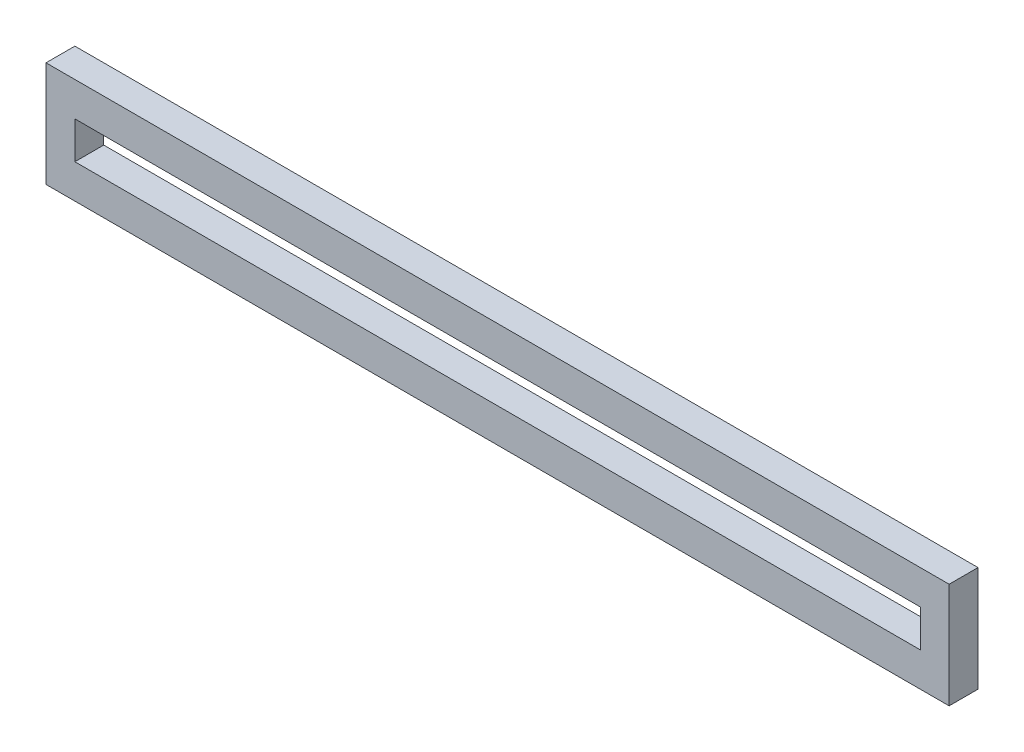
ISO-10303-21;
HEADER;
FILE_DESCRIPTION(('STEP AP214'),'2;1');
FILE_NAME('part.step','',(''),(''),'','','');
FILE_SCHEMA(('AUTOMOTIVE_DESIGN { 1 0 10303 214 1 1 1 1 }'));
ENDSEC;
DATA;
#1=APPLICATION_CONTEXT('core data for automotive mechanical design processes');
#2=APPLICATION_PROTOCOL_DEFINITION('international standard','automotive_design',2000,#1);
#3=PRODUCT_CONTEXT('',#1,'mechanical');
#4=PRODUCT('Part','Part','',(#3));
#5=PRODUCT_RELATED_PRODUCT_CATEGORY('part','',(#4));
#6=PRODUCT_DEFINITION_FORMATION('','',#4);
#7=PRODUCT_DEFINITION_CONTEXT('part definition',#1,'design');
#8=PRODUCT_DEFINITION('design','',#6,#7);
#9=PRODUCT_DEFINITION_SHAPE('','',#8);
#10=(LENGTH_UNIT() NAMED_UNIT(*) SI_UNIT(.MILLI.,.METRE.));
#11=(NAMED_UNIT(*) PLANE_ANGLE_UNIT() SI_UNIT($,.RADIAN.));
#12=(NAMED_UNIT(*) SI_UNIT($,.STERADIAN.) SOLID_ANGLE_UNIT());
#13=UNCERTAINTY_MEASURE_WITH_UNIT(LENGTH_MEASURE(1.E-05),#10,'distance_accuracy_value','');
#14=(GEOMETRIC_REPRESENTATION_CONTEXT(3) GLOBAL_UNCERTAINTY_ASSIGNED_CONTEXT((#13)) GLOBAL_UNIT_ASSIGNED_CONTEXT((#10,
#11,#12)) REPRESENTATION_CONTEXT('',''));
#15=CARTESIAN_POINT('',(0.,0.,0.));
#16=DIRECTION('',(0.,0.,1.));
#17=DIRECTION('',(1.,0.,0.));
#18=AXIS2_PLACEMENT_3D('',#15,#16,#17);
#19=CARTESIAN_POINT('',(0.,0.,2.54));
#20=DIRECTION('',(0.,0.,1.));
#21=DIRECTION('',(1.,0.,0.));
#22=AXIS2_PLACEMENT_3D('',#19,#20,#21);
#23=PLANE('',#22);
#24=DIRECTION('',(0.,1.,0.));
#25=VECTOR('',#24,1.);
#26=CARTESIAN_POINT('',(39.7305521607742,0.,2.54));
#27=LINE('',#26,#25);
#28=CARTESIAN_POINT('',(39.7305521607742,-9.27,2.54));
#29=VERTEX_POINT('',#28);
#30=CARTESIAN_POINT('',(39.7305521607742,0.,2.54));
#31=VERTEX_POINT('',#30);
#32=EDGE_CURVE('E155',#29,#31,#27,.T.);
#33=ORIENTED_EDGE('',*,*,#32,.T.);
#34=DIRECTION('',(-1.,0.,0.));
#35=VECTOR('',#34,1.);
#36=CARTESIAN_POINT('',(39.7305521607742,0.,2.54));
#37=LINE('',#36,#35);
#38=CARTESIAN_POINT('',(-39.7305521607742,0.,2.54));
#39=VERTEX_POINT('',#38);
#40=EDGE_CURVE('E159',#31,#39,#37,.T.);
#41=ORIENTED_EDGE('',*,*,#40,.T.);
#42=DIRECTION('',(0.,-1.,0.));
#43=VECTOR('',#42,1.);
#44=CARTESIAN_POINT('',(-39.7305521607742,0.,2.54));
#45=LINE('',#44,#43);
#46=CARTESIAN_POINT('',(-39.7305521607742,-9.27,2.54));
#47=VERTEX_POINT('',#46);
#48=EDGE_CURVE('E163',#39,#47,#45,.T.);
#49=ORIENTED_EDGE('',*,*,#48,.T.);
#50=DIRECTION('',(1.,0.,0.));
#51=VECTOR('',#50,1.);
#52=CARTESIAN_POINT('',(-39.7305521607742,-9.27,2.54));
#53=LINE('',#52,#51);
#54=EDGE_CURVE('E166',#47,#29,#53,.T.);
#55=ORIENTED_EDGE('',*,*,#54,.T.);
#56=EDGE_LOOP('',(#33,#41,#49,#55));
#57=FACE_BOUND('',#56,.T.);
#58=DIRECTION('',(1.,0.,0.));
#59=VECTOR('',#58,1.);
#60=CARTESIAN_POINT('',(-37.1905521607742,-6.26999999999998,2.54));
#61=LINE('',#60,#59);
#62=CARTESIAN_POINT('',(-37.1905521607742,-6.26999999999998,2.54));
#63=VERTEX_POINT('',#62);
#64=CARTESIAN_POINT('',(37.1905521607742,-6.26999999999998,2.54));
#65=VERTEX_POINT('',#64);
#66=EDGE_CURVE('E116',#63,#65,#61,.T.);
#67=ORIENTED_EDGE('',*,*,#66,.F.);
#68=DIRECTION('',(0.,-1.,0.));
#69=VECTOR('',#68,1.);
#70=CARTESIAN_POINT('',(-37.1905521607742,-2.99999999999997,2.54));
#71=LINE('',#70,#69);
#72=CARTESIAN_POINT('',(-37.1905521607742,-2.99999999999997,2.54));
#73=VERTEX_POINT('',#72);
#74=EDGE_CURVE('E107',#73,#63,#71,.T.);
#75=ORIENTED_EDGE('',*,*,#74,.F.);
#76=DIRECTION('',(-1.,0.,0.));
#77=VECTOR('',#76,1.);
#78=CARTESIAN_POINT('',(37.1905521607742,-2.99999999999996,2.54));
#79=LINE('',#78,#77);
#80=CARTESIAN_POINT('',(37.1905521607742,-2.99999999999996,2.54));
#81=VERTEX_POINT('',#80);
#82=EDGE_CURVE('E133',#81,#73,#79,.T.);
#83=ORIENTED_EDGE('',*,*,#82,.F.);
#84=DIRECTION('',(0.,1.,0.));
#85=VECTOR('',#84,1.);
#86=CARTESIAN_POINT('',(37.1905521607742,-2.99999999999996,2.54));
#87=LINE('',#86,#85);
#88=EDGE_CURVE('E129',#65,#81,#87,.T.);
#89=ORIENTED_EDGE('',*,*,#88,.F.);
#90=EDGE_LOOP('',(#67,#75,#83,#89));
#91=FACE_BOUND('',#90,.T.);
#92=ADVANCED_FACE('F41',(#57,#91),#23,.T.);
#93=CARTESIAN_POINT('',(0.,0.,0.));
#94=DIRECTION('',(0.,0.,1.));
#95=DIRECTION('',(1.,0.,0.));
#96=AXIS2_PLACEMENT_3D('',#93,#94,#95);
#97=PLANE('',#96);
#98=DIRECTION('',(-1.,0.,0.));
#99=VECTOR('',#98,1.);
#100=CARTESIAN_POINT('',(39.7305521607742,0.,0.));
#101=LINE('',#100,#99);
#102=CARTESIAN_POINT('',(39.7305521607742,0.,0.));
#103=VERTEX_POINT('',#102);
#104=CARTESIAN_POINT('',(-39.7305521607742,0.,0.));
#105=VERTEX_POINT('',#104);
#106=EDGE_CURVE('E125',#103,#105,#101,.T.);
#107=ORIENTED_EDGE('',*,*,#106,.F.);
#108=DIRECTION('',(0.,1.,0.));
#109=VECTOR('',#108,1.);
#110=CARTESIAN_POINT('',(39.7305521607742,-9.27,0.));
#111=LINE('',#110,#109);
#112=CARTESIAN_POINT('',(39.7305521607742,-9.27,0.));
#113=VERTEX_POINT('',#112);
#114=EDGE_CURVE('E160',#113,#103,#111,.T.);
#115=ORIENTED_EDGE('',*,*,#114,.F.);
#116=DIRECTION('',(1.,0.,0.));
#117=VECTOR('',#116,1.);
#118=CARTESIAN_POINT('',(-39.7305521607742,-9.27,0.));
#119=LINE('',#118,#117);
#120=CARTESIAN_POINT('',(-39.7305521607742,-9.27,0.));
#121=VERTEX_POINT('',#120);
#122=EDGE_CURVE('E177',#121,#113,#119,.T.);
#123=ORIENTED_EDGE('',*,*,#122,.F.);
#124=DIRECTION('',(0.,-1.,0.));
#125=VECTOR('',#124,1.);
#126=CARTESIAN_POINT('',(-39.7305521607742,-9.27,0.));
#127=LINE('',#126,#125);
#128=EDGE_CURVE('E174',#105,#121,#127,.T.);
#129=ORIENTED_EDGE('',*,*,#128,.F.);
#130=EDGE_LOOP('',(#107,#115,#123,#129));
#131=FACE_BOUND('',#130,.T.);
#132=DIRECTION('',(0.,-1.,0.));
#133=VECTOR('',#132,1.);
#134=CARTESIAN_POINT('',(-37.1905521607742,-2.99999999999997,0.));
#135=LINE('',#134,#133);
#136=CARTESIAN_POINT('',(-37.1905521607742,-2.99999999999997,0.));
#137=VERTEX_POINT('',#136);
#138=CARTESIAN_POINT('',(-37.1905521607742,-6.26999999999998,0.));
#139=VERTEX_POINT('',#138);
#140=EDGE_CURVE('E65',#137,#139,#135,.T.);
#141=ORIENTED_EDGE('',*,*,#140,.T.);
#142=DIRECTION('',(1.,0.,0.));
#143=VECTOR('',#142,1.);
#144=CARTESIAN_POINT('',(-37.1905521607742,-6.26999999999998,0.));
#145=LINE('',#144,#143);
#146=CARTESIAN_POINT('',(37.1905521607742,-6.26999999999998,0.));
#147=VERTEX_POINT('',#146);
#148=EDGE_CURVE('E123',#139,#147,#145,.T.);
#149=ORIENTED_EDGE('',*,*,#148,.T.);
#150=DIRECTION('',(0.,1.,0.));
#151=VECTOR('',#150,1.);
#152=CARTESIAN_POINT('',(37.1905521607742,-2.99999999999996,0.));
#153=LINE('',#152,#151);
#154=CARTESIAN_POINT('',(37.1905521607742,-2.99999999999996,0.));
#155=VERTEX_POINT('',#154);
#156=EDGE_CURVE('E142',#147,#155,#153,.T.);
#157=ORIENTED_EDGE('',*,*,#156,.T.);
#158=DIRECTION('',(-1.,0.,0.));
#159=VECTOR('',#158,1.);
#160=CARTESIAN_POINT('',(37.1905521607742,-2.99999999999996,0.));
#161=LINE('',#160,#159);
#162=EDGE_CURVE('E117',#155,#137,#161,.T.);
#163=ORIENTED_EDGE('',*,*,#162,.T.);
#164=EDGE_LOOP('',(#141,#149,#157,#163));
#165=FACE_BOUND('',#164,.T.);
#166=ADVANCED_FACE('F200',(#131,#165),#97,.F.);
#167=CARTESIAN_POINT('',(39.7305521607742,0.,2.54));
#168=DIRECTION('',(0.,-1.,0.));
#169=DIRECTION('',(1.,0.,0.));
#170=AXIS2_PLACEMENT_3D('',#167,#168,#169);
#171=PLANE('',#170);
#172=ORIENTED_EDGE('',*,*,#106,.T.);
#173=DIRECTION('',(0.,0.,-1.));
#174=VECTOR('',#173,1.);
#175=CARTESIAN_POINT('',(-39.7305521607742,0.,2.54));
#176=LINE('',#175,#174);
#177=EDGE_CURVE('E50',#39,#105,#176,.T.);
#178=ORIENTED_EDGE('',*,*,#177,.F.);
#179=ORIENTED_EDGE('',*,*,#40,.F.);
#180=DIRECTION('',(0.,0.,-1.));
#181=VECTOR('',#180,1.);
#182=CARTESIAN_POINT('',(39.7305521607742,0.,2.54));
#183=LINE('',#182,#181);
#184=EDGE_CURVE('E11',#31,#103,#183,.T.);
#185=ORIENTED_EDGE('',*,*,#184,.T.);
#186=EDGE_LOOP('',(#172,#178,#179,#185));
#187=FACE_BOUND('',#186,.T.);
#188=ADVANCED_FACE('F43',(#187),#171,.F.);
#189=CARTESIAN_POINT('',(-39.7305521607742,-9.27,2.54));
#190=DIRECTION('',(1.,0.,0.));
#191=DIRECTION('',(0.,0.,-1.));
#192=AXIS2_PLACEMENT_3D('',#189,#190,#191);
#193=PLANE('',#192);
#194=ORIENTED_EDGE('',*,*,#128,.T.);
#195=DIRECTION('',(0.,0.,-1.));
#196=VECTOR('',#195,1.);
#197=CARTESIAN_POINT('',(-39.7305521607742,-9.27,2.54));
#198=LINE('',#197,#196);
#199=EDGE_CURVE('E185',#47,#121,#198,.T.);
#200=ORIENTED_EDGE('',*,*,#199,.F.);
#201=ORIENTED_EDGE('',*,*,#48,.F.);
#202=ORIENTED_EDGE('',*,*,#177,.T.);
#203=EDGE_LOOP('',(#194,#200,#201,#202));
#204=FACE_BOUND('',#203,.T.);
#205=ADVANCED_FACE('F193',(#204),#193,.F.);
#206=CARTESIAN_POINT('',(-39.7305521607742,-9.27,2.54));
#207=DIRECTION('',(0.,1.,0.));
#208=DIRECTION('',(-1.,0.,0.));
#209=AXIS2_PLACEMENT_3D('',#206,#207,#208);
#210=PLANE('',#209);
#211=ORIENTED_EDGE('',*,*,#122,.T.);
#212=DIRECTION('',(0.,0.,-1.));
#213=VECTOR('',#212,1.);
#214=CARTESIAN_POINT('',(39.7305521607742,-9.27,2.54));
#215=LINE('',#214,#213);
#216=EDGE_CURVE('E170',#29,#113,#215,.T.);
#217=ORIENTED_EDGE('',*,*,#216,.F.);
#218=ORIENTED_EDGE('',*,*,#54,.F.);
#219=ORIENTED_EDGE('',*,*,#199,.T.);
#220=EDGE_LOOP('',(#211,#217,#218,#219));
#221=FACE_BOUND('',#220,.T.);
#222=ADVANCED_FACE('F205',(#221),#210,.F.);
#223=CARTESIAN_POINT('',(39.7305521607742,-9.27,2.54));
#224=DIRECTION('',(-1.,0.,0.));
#225=DIRECTION('',(0.,-1.,0.));
#226=AXIS2_PLACEMENT_3D('',#223,#224,#225);
#227=PLANE('',#226);
#228=ORIENTED_EDGE('',*,*,#114,.T.);
#229=ORIENTED_EDGE('',*,*,#184,.F.);
#230=ORIENTED_EDGE('',*,*,#32,.F.);
#231=ORIENTED_EDGE('',*,*,#216,.T.);
#232=EDGE_LOOP('',(#228,#229,#230,#231));
#233=FACE_BOUND('',#232,.T.);
#234=ADVANCED_FACE('F208',(#233),#227,.F.);
#235=CARTESIAN_POINT('',(-37.1905521607742,-2.99999999999997,2.54));
#236=DIRECTION('',(1.,0.,0.));
#237=DIRECTION('',(0.,0.,-1.));
#238=AXIS2_PLACEMENT_3D('',#235,#236,#237);
#239=PLANE('',#238);
#240=ORIENTED_EDGE('',*,*,#140,.F.);
#241=DIRECTION('',(0.,0.,-1.));
#242=VECTOR('',#241,1.);
#243=CARTESIAN_POINT('',(-37.1905521607742,-2.99999999999997,2.54));
#244=LINE('',#243,#242);
#245=EDGE_CURVE('E111',#73,#137,#244,.T.);
#246=ORIENTED_EDGE('',*,*,#245,.F.);
#247=ORIENTED_EDGE('',*,*,#74,.T.);
#248=DIRECTION('',(0.,0.,-1.));
#249=VECTOR('',#248,1.);
#250=CARTESIAN_POINT('',(-37.1905521607742,-6.26999999999998,2.54));
#251=LINE('',#250,#249);
#252=EDGE_CURVE('E110',#63,#139,#251,.T.);
#253=ORIENTED_EDGE('',*,*,#252,.T.);
#254=EDGE_LOOP('',(#240,#246,#247,#253));
#255=FACE_BOUND('',#254,.T.);
#256=ADVANCED_FACE('F109',(#255),#239,.T.);
#257=CARTESIAN_POINT('',(-37.1905521607742,-6.26999999999998,2.54));
#258=DIRECTION('',(0.,1.,0.));
#259=DIRECTION('',(0.,0.,1.));
#260=AXIS2_PLACEMENT_3D('',#257,#258,#259);
#261=PLANE('',#260);
#262=ORIENTED_EDGE('',*,*,#148,.F.);
#263=ORIENTED_EDGE('',*,*,#252,.F.);
#264=ORIENTED_EDGE('',*,*,#66,.T.);
#265=DIRECTION('',(0.,0.,-1.));
#266=VECTOR('',#265,1.);
#267=CARTESIAN_POINT('',(37.1905521607742,-6.26999999999998,2.54));
#268=LINE('',#267,#266);
#269=EDGE_CURVE('E126',#65,#147,#268,.T.);
#270=ORIENTED_EDGE('',*,*,#269,.T.);
#271=EDGE_LOOP('',(#262,#263,#264,#270));
#272=FACE_BOUND('',#271,.T.);
#273=ADVANCED_FACE('F120',(#272),#261,.T.);
#274=CARTESIAN_POINT('',(37.1905521607742,-2.99999999999996,2.54));
#275=DIRECTION('',(-1.,0.,0.));
#276=DIRECTION('',(0.,0.,1.));
#277=AXIS2_PLACEMENT_3D('',#274,#275,#276);
#278=PLANE('',#277);
#279=ORIENTED_EDGE('',*,*,#156,.F.);
#280=ORIENTED_EDGE('',*,*,#269,.F.);
#281=ORIENTED_EDGE('',*,*,#88,.T.);
#282=DIRECTION('',(0.,0.,-1.));
#283=VECTOR('',#282,1.);
#284=CARTESIAN_POINT('',(37.1905521607742,-2.99999999999996,2.54));
#285=LINE('',#284,#283);
#286=EDGE_CURVE('E57',#81,#155,#285,.T.);
#287=ORIENTED_EDGE('',*,*,#286,.T.);
#288=EDGE_LOOP('',(#279,#280,#281,#287));
#289=FACE_BOUND('',#288,.T.);
#290=ADVANCED_FACE('F287',(#289),#278,.T.);
#291=CARTESIAN_POINT('',(37.1905521607742,-2.99999999999996,2.54));
#292=DIRECTION('',(0.,-1.,0.));
#293=DIRECTION('',(1.,0.,0.));
#294=AXIS2_PLACEMENT_3D('',#291,#292,#293);
#295=PLANE('',#294);
#296=ORIENTED_EDGE('',*,*,#162,.F.);
#297=ORIENTED_EDGE('',*,*,#286,.F.);
#298=ORIENTED_EDGE('',*,*,#82,.T.);
#299=ORIENTED_EDGE('',*,*,#245,.T.);
#300=EDGE_LOOP('',(#296,#297,#298,#299));
#301=FACE_BOUND('',#300,.T.);
#302=ADVANCED_FACE('F295',(#301),#295,.T.);
#303=CLOSED_SHELL('',(#92,#166,#188,#205,#222,#234,#256,#273,#290,#302));
#304=MANIFOLD_SOLID_BREP('B2',#303);
#305=ADVANCED_BREP_SHAPE_REPRESENTATION('',(#18,#304),#14);
#306=SHAPE_DEFINITION_REPRESENTATION(#9,#305);
ENDSEC;
END-ISO-10303-21;
